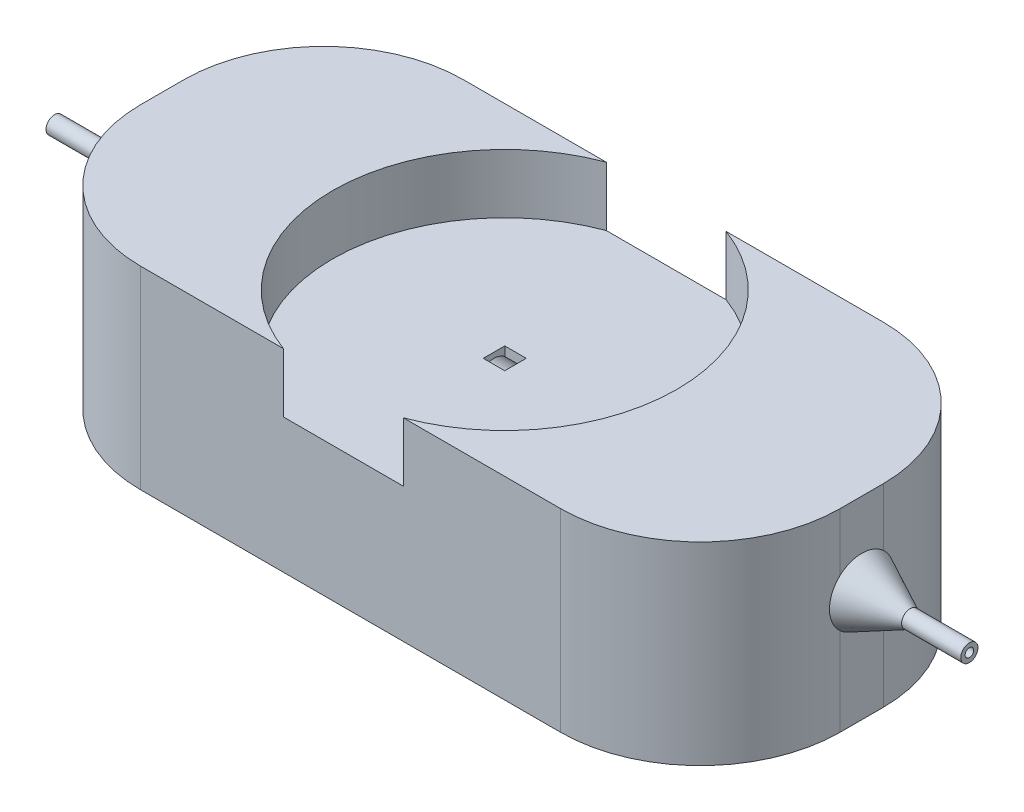
ISO-10303-21;
HEADER;
FILE_DESCRIPTION(('STEP AP214'),'2;1');
FILE_NAME('part.step','',(''),(''),'','','');
FILE_SCHEMA(('AUTOMOTIVE_DESIGN { 1 0 10303 214 1 1 1 1 }'));
ENDSEC;
DATA;
#1=APPLICATION_CONTEXT('core data for automotive mechanical design processes');
#2=APPLICATION_PROTOCOL_DEFINITION('international standard','automotive_design',2000,#1);
#3=PRODUCT_CONTEXT('',#1,'mechanical');
#4=PRODUCT('Part','Part','',(#3));
#5=PRODUCT_RELATED_PRODUCT_CATEGORY('part','',(#4));
#6=PRODUCT_DEFINITION_FORMATION('','',#4);
#7=PRODUCT_DEFINITION_CONTEXT('part definition',#1,'design');
#8=PRODUCT_DEFINITION('design','',#6,#7);
#9=PRODUCT_DEFINITION_SHAPE('','',#8);
#10=(LENGTH_UNIT() NAMED_UNIT(*) SI_UNIT(.MILLI.,.METRE.));
#11=(NAMED_UNIT(*) PLANE_ANGLE_UNIT() SI_UNIT($,.RADIAN.));
#12=(NAMED_UNIT(*) SI_UNIT($,.STERADIAN.) SOLID_ANGLE_UNIT());
#13=UNCERTAINTY_MEASURE_WITH_UNIT(LENGTH_MEASURE(1.E-05),#10,'distance_accuracy_value','');
#14=(GEOMETRIC_REPRESENTATION_CONTEXT(3) GLOBAL_UNCERTAINTY_ASSIGNED_CONTEXT((#13)) GLOBAL_UNIT_ASSIGNED_CONTEXT((#10,
#11,#12)) REPRESENTATION_CONTEXT('',''));
#15=CARTESIAN_POINT('',(0.,0.,0.));
#16=DIRECTION('',(0.,0.,1.));
#17=DIRECTION('',(1.,0.,0.));
#18=AXIS2_PLACEMENT_3D('',#15,#16,#17);
#19=CARTESIAN_POINT('',(40.,58.,15.));
#20=DIRECTION('',(-1.,0.,0.));
#21=DIRECTION('',(0.,0.,1.));
#22=AXIS2_PLACEMENT_3D('',#19,#20,#21);
#23=PLANE('',#22);
#24=DIRECTION('',(0.,-1.,0.));
#25=VECTOR('',#24,1.);
#26=CARTESIAN_POINT('',(40.,58.,2.00000000000001));
#27=LINE('',#26,#25);
#28=CARTESIAN_POINT('',(40.,58.,2.00000000000001));
#29=VERTEX_POINT('',#28);
#30=CARTESIAN_POINT('',(40.,52.6346340871573,2.00000000000001));
#31=VERTEX_POINT('',#30);
#32=EDGE_CURVE('E220',#29,#31,#27,.T.);
#33=ORIENTED_EDGE('',*,*,#32,.T.);
#34=CARTESIAN_POINT('',(40.,50.3985661096575,0.));
#35=DIRECTION('',(1.,0.,0.));
#36=DIRECTION('',(0.,0.,-1.));
#37=AXIS2_PLACEMENT_3D('',#34,#35,#36);
#38=CIRCLE('',#37,3.);
#39=CARTESIAN_POINT('',(40.,52.6346340871573,-2.));
#40=VERTEX_POINT('',#39);
#41=EDGE_CURVE('E62',#40,#31,#38,.T.);
#42=ORIENTED_EDGE('',*,*,#41,.F.);
#43=DIRECTION('',(0.,-1.,0.));
#44=VECTOR('',#43,1.);
#45=CARTESIAN_POINT('',(40.,58.,-2.));
#46=LINE('',#45,#44);
#47=CARTESIAN_POINT('',(40.,58.,-2.));
#48=VERTEX_POINT('',#47);
#49=EDGE_CURVE('E369',#40,#48,#46,.F.);
#50=ORIENTED_EDGE('',*,*,#49,.T.);
#51=DIRECTION('',(0.,0.,-1.));
#52=VECTOR('',#51,1.);
#53=CARTESIAN_POINT('',(40.,58.,15.));
#54=LINE('',#53,#52);
#55=EDGE_CURVE('E350',#29,#48,#54,.T.);
#56=ORIENTED_EDGE('',*,*,#55,.F.);
#57=EDGE_LOOP('',(#33,#42,#50,#56));
#58=FACE_BOUND('',#57,.T.);
#59=ADVANCED_FACE('F45',(#58),#23,.F.);
#60=CARTESIAN_POINT('',(-25.,58.,15.));
#61=DIRECTION('',(1.,0.,0.));
#62=DIRECTION('',(0.,0.,-1.));
#63=AXIS2_PLACEMENT_3D('',#60,#61,#62);
#64=PLANE('',#63);
#65=DIRECTION('',(0.,-1.,0.));
#66=VECTOR('',#65,1.);
#67=CARTESIAN_POINT('',(-25.,58.,-1.99999999999999));
#68=LINE('',#67,#66);
#69=CARTESIAN_POINT('',(-25.,58.,-1.99999999999999));
#70=VERTEX_POINT('',#69);
#71=CARTESIAN_POINT('',(-25.,52.6360679774998,-1.99999999999999));
#72=VERTEX_POINT('',#71);
#73=EDGE_CURVE('E384',#70,#72,#68,.T.);
#74=ORIENTED_EDGE('',*,*,#73,.T.);
#75=CARTESIAN_POINT('',(-25.,50.4,0.));
#76=DIRECTION('',(1.,0.,0.));
#77=DIRECTION('',(0.,0.,-1.));
#78=AXIS2_PLACEMENT_3D('',#75,#76,#77);
#79=CIRCLE('',#78,3.);
#80=CARTESIAN_POINT('',(-25.,52.6360679774998,2.00000000000001));
#81=VERTEX_POINT('',#80);
#82=EDGE_CURVE('E264',#72,#81,#79,.T.);
#83=ORIENTED_EDGE('',*,*,#82,.T.);
#84=DIRECTION('',(0.,-1.,0.));
#85=VECTOR('',#84,1.);
#86=CARTESIAN_POINT('',(-25.,58.,2.00000000000001));
#87=LINE('',#86,#85);
#88=CARTESIAN_POINT('',(-25.,58.,2.00000000000001));
#89=VERTEX_POINT('',#88);
#90=EDGE_CURVE('E379',#81,#89,#87,.F.);
#91=ORIENTED_EDGE('',*,*,#90,.T.);
#92=DIRECTION('',(0.,0.,1.));
#93=VECTOR('',#92,1.);
#94=CARTESIAN_POINT('',(-25.,58.,15.));
#95=LINE('',#94,#93);
#96=EDGE_CURVE('E357',#70,#89,#95,.T.);
#97=ORIENTED_EDGE('',*,*,#96,.F.);
#98=EDGE_LOOP('',(#74,#83,#91,#97));
#99=FACE_BOUND('',#98,.T.);
#100=ADVANCED_FACE('F448',(#99),#64,.F.);
#101=CARTESIAN_POINT('',(0.,58.,0.));
#102=DIRECTION('',(0.,-1.,0.));
#103=DIRECTION('',(0.,0.,-1.));
#104=AXIS2_PLACEMENT_3D('',#101,#102,#103);
#105=PLANE('',#104);
#106=DIRECTION('',(-1.,0.,0.));
#107=VECTOR('',#106,1.);
#108=CARTESIAN_POINT('',(-25.,58.,-15.));
#109=LINE('',#108,#107);
#110=CARTESIAN_POINT('',(27.,58.,-15.));
#111=VERTEX_POINT('',#110);
#112=CARTESIAN_POINT('',(12.3962726493241,58.,-15.));
#113=VERTEX_POINT('',#112);
#114=EDGE_CURVE('E354',#111,#113,#109,.T.);
#115=ORIENTED_EDGE('',*,*,#114,.T.);
#116=CARTESIAN_POINT('',(6.82850828649366,58.,-1.6826817716975E-13));
#117=DIRECTION('',(0.,1.,0.));
#118=DIRECTION('',(0.,0.,1.));
#119=AXIS2_PLACEMENT_3D('',#116,#117,#118);
#120=CIRCLE('',#119,16.);
#121=CARTESIAN_POINT('',(12.3962726493232,58.,15.));
#122=VERTEX_POINT('',#121);
#123=EDGE_CURVE('E303',#122,#113,#120,.T.);
#124=ORIENTED_EDGE('',*,*,#123,.F.);
#125=DIRECTION('',(1.,0.,0.));
#126=VECTOR('',#125,1.);
#127=CARTESIAN_POINT('',(-25.,58.,15.));
#128=LINE('',#127,#126);
#129=CARTESIAN_POINT('',(27.,58.,15.));
#130=VERTEX_POINT('',#129);
#131=EDGE_CURVE('E360',#122,#130,#128,.T.);
#132=ORIENTED_EDGE('',*,*,#131,.T.);
#133=CARTESIAN_POINT('',(27.,58.,2.00000000000001));
#134=DIRECTION('',(0.,-1.,0.));
#135=DIRECTION('',(0.,0.,-1.));
#136=AXIS2_PLACEMENT_3D('',#133,#134,#135);
#137=CIRCLE('',#136,13.);
#138=EDGE_CURVE('E373',#130,#29,#137,.F.);
#139=ORIENTED_EDGE('',*,*,#138,.T.);
#140=ORIENTED_EDGE('',*,*,#55,.T.);
#141=CARTESIAN_POINT('',(27.,58.,-2.));
#142=DIRECTION('',(0.,-1.,0.));
#143=DIRECTION('',(0.,0.,-1.));
#144=AXIS2_PLACEMENT_3D('',#141,#142,#143);
#145=CIRCLE('',#144,13.);
#146=EDGE_CURVE('E377',#48,#111,#145,.F.);
#147=ORIENTED_EDGE('',*,*,#146,.T.);
#148=EDGE_LOOP('',(#115,#124,#132,#139,#140,#147));
#149=FACE_BOUND('',#148,.T.);
#150=ADVANCED_FACE('F455',(#149),#105,.F.);
#151=CARTESIAN_POINT('',(40.,40.,-2.));
#152=VERTEX_POINT('',#151);
#153=CARTESIAN_POINT('',(40.,48.1624981321577,-2.));
#154=VERTEX_POINT('',#153);
#155=EDGE_CURVE('E226',#152,#154,#46,.F.);
#156=ORIENTED_EDGE('',*,*,#155,.T.);
#157=CARTESIAN_POINT('',(40.,48.1624981321577,2.00000000000001));
#158=VERTEX_POINT('',#157);
#159=EDGE_CURVE('E224',#158,#154,#38,.T.);
#160=ORIENTED_EDGE('',*,*,#159,.F.);
#161=CARTESIAN_POINT('',(40.,40.,2.00000000000001));
#162=VERTEX_POINT('',#161);
#163=EDGE_CURVE('E209',#158,#162,#27,.T.);
#164=ORIENTED_EDGE('',*,*,#163,.T.);
#165=DIRECTION('',(0.,0.,1.));
#166=VECTOR('',#165,1.);
#167=CARTESIAN_POINT('',(40.,40.,15.));
#168=LINE('',#167,#166);
#169=EDGE_CURVE('E345',#152,#162,#168,.T.);
#170=ORIENTED_EDGE('',*,*,#169,.F.);
#171=EDGE_LOOP('',(#156,#160,#164,#170));
#172=FACE_BOUND('',#171,.T.);
#173=ADVANCED_FACE('F225',(#172),#23,.F.);
#174=CARTESIAN_POINT('',(-25.,58.,-15.));
#175=DIRECTION('',(0.,0.,1.));
#176=DIRECTION('',(1.,0.,0.));
#177=AXIS2_PLACEMENT_3D('',#174,#175,#176);
#178=PLANE('',#177);
#179=DIRECTION('',(-1.,0.,0.));
#180=VECTOR('',#179,1.);
#181=CARTESIAN_POINT('',(-25.,52.5,-15.));
#182=LINE('',#181,#180);
#183=CARTESIAN_POINT('',(12.3962726493241,52.5,-15.));
#184=VERTEX_POINT('',#183);
#185=CARTESIAN_POINT('',(1.26074392366317,52.5,-15.));
#186=VERTEX_POINT('',#185);
#187=EDGE_CURVE('E332',#184,#186,#182,.T.);
#188=ORIENTED_EDGE('',*,*,#187,.F.);
#189=DIRECTION('',(0.,1.,0.));
#190=VECTOR('',#189,1.);
#191=CARTESIAN_POINT('',(12.3962726493241,52.5,-15.));
#192=LINE('',#191,#190);
#193=EDGE_CURVE('E329',#184,#113,#192,.T.);
#194=ORIENTED_EDGE('',*,*,#193,.T.);
#195=ORIENTED_EDGE('',*,*,#114,.F.);
#196=DIRECTION('',(0.,-1.,0.));
#197=VECTOR('',#196,1.);
#198=CARTESIAN_POINT('',(27.,58.,-15.));
#199=LINE('',#198,#197);
#200=CARTESIAN_POINT('',(27.,40.,-15.));
#201=VERTEX_POINT('',#200);
#202=EDGE_CURVE('E221',#111,#201,#199,.T.);
#203=ORIENTED_EDGE('',*,*,#202,.T.);
#204=DIRECTION('',(1.,0.,0.));
#205=VECTOR('',#204,1.);
#206=CARTESIAN_POINT('',(-25.,40.,-15.));
#207=LINE('',#206,#205);
#208=CARTESIAN_POINT('',(-12.,40.,-15.));
#209=VERTEX_POINT('',#208);
#210=EDGE_CURVE('E343',#209,#201,#207,.T.);
#211=ORIENTED_EDGE('',*,*,#210,.F.);
#212=DIRECTION('',(0.,-1.,0.));
#213=VECTOR('',#212,1.);
#214=CARTESIAN_POINT('',(-12.,58.,-15.));
#215=LINE('',#214,#213);
#216=CARTESIAN_POINT('',(-12.,58.,-15.));
#217=VERTEX_POINT('',#216);
#218=EDGE_CURVE('E364',#209,#217,#215,.F.);
#219=ORIENTED_EDGE('',*,*,#218,.T.);
#220=CARTESIAN_POINT('',(1.26074392366317,58.,-15.));
#221=VERTEX_POINT('',#220);
#222=EDGE_CURVE('E353',#221,#217,#109,.T.);
#223=ORIENTED_EDGE('',*,*,#222,.F.);
#224=DIRECTION('',(0.,1.,0.));
#225=VECTOR('',#224,1.);
#226=CARTESIAN_POINT('',(1.26074392366316,52.5,-15.));
#227=LINE('',#226,#225);
#228=EDGE_CURVE('E326',#221,#186,#227,.F.);
#229=ORIENTED_EDGE('',*,*,#228,.T.);
#230=EDGE_LOOP('',(#188,#194,#195,#203,#211,#219,#223,#229));
#231=FACE_BOUND('',#230,.T.);
#232=ADVANCED_FACE('F461',(#231),#178,.F.);
#233=CARTESIAN_POINT('',(-25.,40.,2.00000000000001));
#234=VERTEX_POINT('',#233);
#235=CARTESIAN_POINT('',(-25.,48.1639320225002,2.00000000000001));
#236=VERTEX_POINT('',#235);
#237=EDGE_CURVE('E380',#234,#236,#87,.F.);
#238=ORIENTED_EDGE('',*,*,#237,.T.);
#239=CARTESIAN_POINT('',(-25.,48.1639320225002,-1.99999999999999));
#240=VERTEX_POINT('',#239);
#241=EDGE_CURVE('E500',#236,#240,#79,.T.);
#242=ORIENTED_EDGE('',*,*,#241,.T.);
#243=CARTESIAN_POINT('',(-25.,40.,-1.99999999999999));
#244=VERTEX_POINT('',#243);
#245=EDGE_CURVE('E383',#240,#244,#68,.T.);
#246=ORIENTED_EDGE('',*,*,#245,.T.);
#247=DIRECTION('',(0.,0.,-1.));
#248=VECTOR('',#247,1.);
#249=CARTESIAN_POINT('',(-25.,40.,15.));
#250=LINE('',#249,#248);
#251=EDGE_CURVE('E336',#234,#244,#250,.T.);
#252=ORIENTED_EDGE('',*,*,#251,.F.);
#253=EDGE_LOOP('',(#238,#242,#246,#252));
#254=FACE_BOUND('',#253,.T.);
#255=ADVANCED_FACE('F458',(#254),#64,.F.);
#256=CARTESIAN_POINT('',(-25.,58.,15.));
#257=DIRECTION('',(0.,0.,-1.));
#258=DIRECTION('',(-1.,0.,0.));
#259=AXIS2_PLACEMENT_3D('',#256,#257,#258);
#260=PLANE('',#259);
#261=DIRECTION('',(1.,0.,0.));
#262=VECTOR('',#261,1.);
#263=CARTESIAN_POINT('',(-25.,52.5,15.));
#264=LINE('',#263,#262);
#265=CARTESIAN_POINT('',(1.2607439236641,52.5,15.));
#266=VERTEX_POINT('',#265);
#267=CARTESIAN_POINT('',(12.3962726493232,52.5,15.));
#268=VERTEX_POINT('',#267);
#269=EDGE_CURVE('E399',#266,#268,#264,.T.);
#270=ORIENTED_EDGE('',*,*,#269,.F.);
#271=DIRECTION('',(0.,1.,0.));
#272=VECTOR('',#271,1.);
#273=CARTESIAN_POINT('',(1.26074392366409,52.5,15.));
#274=LINE('',#273,#272);
#275=CARTESIAN_POINT('',(1.2607439236641,58.,15.));
#276=VERTEX_POINT('',#275);
#277=EDGE_CURVE('E323',#266,#276,#274,.T.);
#278=ORIENTED_EDGE('',*,*,#277,.T.);
#279=CARTESIAN_POINT('',(-12.,58.,15.));
#280=VERTEX_POINT('',#279);
#281=EDGE_CURVE('E361',#280,#276,#128,.T.);
#282=ORIENTED_EDGE('',*,*,#281,.F.);
#283=DIRECTION('',(0.,-1.,0.));
#284=VECTOR('',#283,1.);
#285=CARTESIAN_POINT('',(-12.,58.,15.));
#286=LINE('',#285,#284);
#287=CARTESIAN_POINT('',(-12.,40.,15.));
#288=VERTEX_POINT('',#287);
#289=EDGE_CURVE('E387',#280,#288,#286,.T.);
#290=ORIENTED_EDGE('',*,*,#289,.T.);
#291=DIRECTION('',(-1.,0.,0.));
#292=VECTOR('',#291,1.);
#293=CARTESIAN_POINT('',(-25.,40.,15.));
#294=LINE('',#293,#292);
#295=CARTESIAN_POINT('',(27.,40.,15.));
#296=VERTEX_POINT('',#295);
#297=EDGE_CURVE('E334',#296,#288,#294,.T.);
#298=ORIENTED_EDGE('',*,*,#297,.F.);
#299=DIRECTION('',(0.,-1.,0.));
#300=VECTOR('',#299,1.);
#301=CARTESIAN_POINT('',(27.,58.,15.));
#302=LINE('',#301,#300);
#303=EDGE_CURVE('E390',#296,#130,#302,.F.);
#304=ORIENTED_EDGE('',*,*,#303,.T.);
#305=ORIENTED_EDGE('',*,*,#131,.F.);
#306=DIRECTION('',(0.,1.,0.));
#307=VECTOR('',#306,1.);
#308=CARTESIAN_POINT('',(12.3962726493232,52.5,15.));
#309=LINE('',#308,#307);
#310=EDGE_CURVE('E318',#122,#268,#309,.F.);
#311=ORIENTED_EDGE('',*,*,#310,.T.);
#312=EDGE_LOOP('',(#270,#278,#282,#290,#298,#304,#305,#311));
#313=FACE_BOUND('',#312,.T.);
#314=ADVANCED_FACE('F493',(#313),#260,.F.);
#315=CARTESIAN_POINT('',(27.,58.,-2.));
#316=DIRECTION('',(0.,-1.,0.));
#317=DIRECTION('',(0.,0.,-1.));
#318=AXIS2_PLACEMENT_3D('',#315,#316,#317);
#319=CYLINDRICAL_SURFACE('',#318,13.);
#320=ORIENTED_EDGE('',*,*,#155,.F.);
#321=CARTESIAN_POINT('',(27.,40.,-2.));
#322=DIRECTION('',(0.,-1.,0.));
#323=DIRECTION('',(0.,0.,-1.));
#324=AXIS2_PLACEMENT_3D('',#321,#322,#323);
#325=CIRCLE('',#324,13.);
#326=EDGE_CURVE('E347',#152,#201,#325,.F.);
#327=ORIENTED_EDGE('',*,*,#326,.T.);
#328=ORIENTED_EDGE('',*,*,#202,.F.);
#329=ORIENTED_EDGE('',*,*,#146,.F.);
#330=ORIENTED_EDGE('',*,*,#49,.F.);
#331=DIRECTION('',(0.,-1.,0.));
#332=VECTOR('',#331,1.);
#333=CARTESIAN_POINT('',(40.,58.,-2.));
#334=LINE('',#333,#332);
#335=EDGE_CURVE('E69',#154,#40,#334,.F.);
#336=ORIENTED_EDGE('',*,*,#335,.F.);
#337=EDGE_LOOP('',(#320,#327,#328,#329,#330,#336));
#338=FACE_BOUND('',#337,.T.);
#339=ADVANCED_FACE('F522',(#338),#319,.T.);
#340=CARTESIAN_POINT('',(-12.,58.,-1.99999999999999));
#341=DIRECTION('',(0.,-1.,0.));
#342=DIRECTION('',(0.,0.,-1.));
#343=AXIS2_PLACEMENT_3D('',#340,#341,#342);
#344=CYLINDRICAL_SURFACE('',#343,13.);
#345=ORIENTED_EDGE('',*,*,#218,.F.);
#346=CARTESIAN_POINT('',(-12.,40.,-1.99999999999999));
#347=DIRECTION('',(0.,-1.,0.));
#348=DIRECTION('',(0.,0.,-1.));
#349=AXIS2_PLACEMENT_3D('',#346,#347,#348);
#350=CIRCLE('',#349,13.);
#351=EDGE_CURVE('E340',#209,#244,#350,.F.);
#352=ORIENTED_EDGE('',*,*,#351,.T.);
#353=ORIENTED_EDGE('',*,*,#245,.F.);
#354=DIRECTION('',(0.,-1.,0.));
#355=VECTOR('',#354,1.);
#356=CARTESIAN_POINT('',(-25.,58.,-1.99999999999999));
#357=LINE('',#356,#355);
#358=EDGE_CURVE('E274',#240,#72,#357,.F.);
#359=ORIENTED_EDGE('',*,*,#358,.T.);
#360=ORIENTED_EDGE('',*,*,#73,.F.);
#361=CARTESIAN_POINT('',(-12.,58.,-1.99999999999999));
#362=DIRECTION('',(0.,-1.,0.));
#363=DIRECTION('',(0.,0.,-1.));
#364=AXIS2_PLACEMENT_3D('',#361,#362,#363);
#365=CIRCLE('',#364,13.);
#366=EDGE_CURVE('E375',#217,#70,#365,.F.);
#367=ORIENTED_EDGE('',*,*,#366,.F.);
#368=EDGE_LOOP('',(#345,#352,#353,#359,#360,#367));
#369=FACE_BOUND('',#368,.T.);
#370=ADVANCED_FACE('F504',(#369),#344,.T.);
#371=CARTESIAN_POINT('',(27.,58.,2.00000000000001));
#372=DIRECTION('',(0.,-1.,0.));
#373=DIRECTION('',(0.,0.,-1.));
#374=AXIS2_PLACEMENT_3D('',#371,#372,#373);
#375=CYLINDRICAL_SURFACE('',#374,13.);
#376=ORIENTED_EDGE('',*,*,#303,.F.);
#377=CARTESIAN_POINT('',(27.,40.,2.00000000000001));
#378=DIRECTION('',(0.,-1.,0.));
#379=DIRECTION('',(0.,0.,-1.));
#380=AXIS2_PLACEMENT_3D('',#377,#378,#379);
#381=CIRCLE('',#380,13.);
#382=EDGE_CURVE('E216',#296,#162,#381,.F.);
#383=ORIENTED_EDGE('',*,*,#382,.T.);
#384=ORIENTED_EDGE('',*,*,#163,.F.);
#385=DIRECTION('',(0.,-1.,0.));
#386=VECTOR('',#385,1.);
#387=CARTESIAN_POINT('',(40.,58.,2.00000000000001));
#388=LINE('',#387,#386);
#389=EDGE_CURVE('E215',#158,#31,#388,.F.);
#390=ORIENTED_EDGE('',*,*,#389,.T.);
#391=ORIENTED_EDGE('',*,*,#32,.F.);
#392=ORIENTED_EDGE('',*,*,#138,.F.);
#393=EDGE_LOOP('',(#376,#383,#384,#390,#391,#392));
#394=FACE_BOUND('',#393,.T.);
#395=ADVANCED_FACE('F212',(#394),#375,.T.);
#396=CARTESIAN_POINT('',(-12.,58.,2.00000000000001));
#397=DIRECTION('',(0.,-1.,0.));
#398=DIRECTION('',(0.,0.,-1.));
#399=AXIS2_PLACEMENT_3D('',#396,#397,#398);
#400=CYLINDRICAL_SURFACE('',#399,13.);
#401=ORIENTED_EDGE('',*,*,#237,.F.);
#402=CARTESIAN_POINT('',(-12.,40.,2.00000000000001));
#403=DIRECTION('',(0.,-1.,0.));
#404=DIRECTION('',(0.,0.,-1.));
#405=AXIS2_PLACEMENT_3D('',#402,#403,#404);
#406=CIRCLE('',#405,13.);
#407=EDGE_CURVE('E393',#234,#288,#406,.F.);
#408=ORIENTED_EDGE('',*,*,#407,.T.);
#409=ORIENTED_EDGE('',*,*,#289,.F.);
#410=CARTESIAN_POINT('',(-12.,58.,2.00000000000001));
#411=DIRECTION('',(0.,-1.,0.));
#412=DIRECTION('',(0.,0.,-1.));
#413=AXIS2_PLACEMENT_3D('',#410,#411,#412);
#414=CIRCLE('',#413,13.);
#415=EDGE_CURVE('E371',#89,#280,#414,.F.);
#416=ORIENTED_EDGE('',*,*,#415,.F.);
#417=ORIENTED_EDGE('',*,*,#90,.F.);
#418=DIRECTION('',(0.,-1.,0.));
#419=VECTOR('',#418,1.);
#420=CARTESIAN_POINT('',(-25.,58.,2.00000000000001));
#421=LINE('',#420,#419);
#422=EDGE_CURVE('E271',#236,#81,#421,.F.);
#423=ORIENTED_EDGE('',*,*,#422,.F.);
#424=EDGE_LOOP('',(#401,#408,#409,#416,#417,#423));
#425=FACE_BOUND('',#424,.T.);
#426=ADVANCED_FACE('F47',(#425),#400,.T.);
#427=ORIENTED_EDGE('',*,*,#281,.T.);
#428=CARTESIAN_POINT('',(6.82850828649366,58.,-1.6826817716975E-13));
#429=DIRECTION('',(0.,-1.,0.));
#430=DIRECTION('',(0.,0.,-1.));
#431=AXIS2_PLACEMENT_3D('',#428,#429,#430);
#432=CIRCLE('',#431,16.);
#433=EDGE_CURVE('E396',#276,#221,#432,.T.);
#434=ORIENTED_EDGE('',*,*,#433,.T.);
#435=ORIENTED_EDGE('',*,*,#222,.T.);
#436=ORIENTED_EDGE('',*,*,#366,.T.);
#437=ORIENTED_EDGE('',*,*,#96,.T.);
#438=ORIENTED_EDGE('',*,*,#415,.T.);
#439=EDGE_LOOP('',(#427,#434,#435,#436,#437,#438));
#440=FACE_BOUND('',#439,.T.);
#441=ADVANCED_FACE('F470',(#440),#105,.F.);
#442=CARTESIAN_POINT('',(0.,40.,0.));
#443=DIRECTION('',(0.,-1.,0.));
#444=DIRECTION('',(0.,0.,-1.));
#445=AXIS2_PLACEMENT_3D('',#442,#443,#444);
#446=PLANE('',#445);
#447=ORIENTED_EDGE('',*,*,#169,.T.);
#448=ORIENTED_EDGE('',*,*,#382,.F.);
#449=ORIENTED_EDGE('',*,*,#297,.T.);
#450=ORIENTED_EDGE('',*,*,#407,.F.);
#451=ORIENTED_EDGE('',*,*,#251,.T.);
#452=ORIENTED_EDGE('',*,*,#351,.F.);
#453=ORIENTED_EDGE('',*,*,#210,.T.);
#454=ORIENTED_EDGE('',*,*,#326,.F.);
#455=EDGE_LOOP('',(#447,#448,#449,#450,#451,#452,#453,#454));
#456=FACE_BOUND('',#455,.T.);
#457=ADVANCED_FACE('F477',(#456),#446,.T.);
#458=CARTESIAN_POINT('',(6.82850828649366,52.5,-1.6826817716975E-13));
#459=DIRECTION('',(0.,1.,0.));
#460=DIRECTION('',(0.,0.,1.));
#461=AXIS2_PLACEMENT_3D('',#458,#459,#460);
#462=PLANE('',#461);
#463=DIRECTION('',(0.,0.,-1.));
#464=VECTOR('',#463,1.);
#465=CARTESIAN_POINT('',(7.82850828649366,52.5,0.999999999999832));
#466=LINE('',#465,#464);
#467=CARTESIAN_POINT('',(7.82850828649366,52.5,0.999999999999832));
#468=VERTEX_POINT('',#467);
#469=CARTESIAN_POINT('',(7.82850828649366,52.5,-1.00000000000017));
#470=VERTEX_POINT('',#469);
#471=EDGE_CURVE('E276',#468,#470,#466,.T.);
#472=ORIENTED_EDGE('',*,*,#471,.F.);
#473=DIRECTION('',(1.,0.,0.));
#474=VECTOR('',#473,1.);
#475=CARTESIAN_POINT('',(5.82850828649366,52.5,0.999999999999832));
#476=LINE('',#475,#474);
#477=CARTESIAN_POINT('',(5.82850828649366,52.5,0.999999999999832));
#478=VERTEX_POINT('',#477);
#479=EDGE_CURVE('E281',#478,#468,#476,.T.);
#480=ORIENTED_EDGE('',*,*,#479,.F.);
#481=DIRECTION('',(0.,0.,1.));
#482=VECTOR('',#481,1.);
#483=CARTESIAN_POINT('',(5.82850828649366,52.5,0.999999999999832));
#484=LINE('',#483,#482);
#485=CARTESIAN_POINT('',(5.82850828649366,52.5,-1.00000000000017));
#486=VERTEX_POINT('',#485);
#487=EDGE_CURVE('E295',#486,#478,#484,.T.);
#488=ORIENTED_EDGE('',*,*,#487,.F.);
#489=DIRECTION('',(-1.,0.,0.));
#490=VECTOR('',#489,1.);
#491=CARTESIAN_POINT('',(5.82850828649366,52.5,-1.00000000000017));
#492=LINE('',#491,#490);
#493=EDGE_CURVE('E292',#470,#486,#492,.T.);
#494=ORIENTED_EDGE('',*,*,#493,.F.);
#495=EDGE_LOOP('',(#472,#480,#488,#494));
#496=FACE_BOUND('',#495,.T.);
#497=ORIENTED_EDGE('',*,*,#187,.T.);
#498=CARTESIAN_POINT('',(6.82850828649366,52.5,-1.6826817716975E-13));
#499=DIRECTION('',(0.,1.,0.));
#500=DIRECTION('',(0.,0.,1.));
#501=AXIS2_PLACEMENT_3D('',#498,#499,#500);
#502=CIRCLE('',#501,16.);
#503=EDGE_CURVE('E319',#186,#266,#502,.T.);
#504=ORIENTED_EDGE('',*,*,#503,.T.);
#505=ORIENTED_EDGE('',*,*,#269,.T.);
#506=EDGE_CURVE('E315',#268,#184,#502,.T.);
#507=ORIENTED_EDGE('',*,*,#506,.T.);
#508=EDGE_LOOP('',(#497,#504,#505,#507));
#509=FACE_BOUND('',#508,.T.);
#510=ADVANCED_FACE('F483',(#496,#509),#462,.T.);
#511=CARTESIAN_POINT('',(6.82850828649366,52.5,-1.6826817716975E-13));
#512=DIRECTION('',(0.,1.,0.));
#513=DIRECTION('',(0.,0.,1.));
#514=AXIS2_PLACEMENT_3D('',#511,#512,#513);
#515=CYLINDRICAL_SURFACE('',#514,16.);
#516=ORIENTED_EDGE('',*,*,#506,.F.);
#517=ORIENTED_EDGE('',*,*,#310,.F.);
#518=ORIENTED_EDGE('',*,*,#123,.T.);
#519=ORIENTED_EDGE('',*,*,#193,.F.);
#520=EDGE_LOOP('',(#516,#517,#518,#519));
#521=FACE_BOUND('',#520,.T.);
#522=ADVANCED_FACE('F528',(#521),#515,.F.);
#523=ORIENTED_EDGE('',*,*,#433,.F.);
#524=ORIENTED_EDGE('',*,*,#277,.F.);
#525=ORIENTED_EDGE('',*,*,#503,.F.);
#526=ORIENTED_EDGE('',*,*,#228,.F.);
#527=EDGE_LOOP('',(#523,#524,#525,#526));
#528=FACE_BOUND('',#527,.T.);
#529=ADVANCED_FACE('F535',(#528),#515,.F.);
#530=CARTESIAN_POINT('',(40.001,50.4,0.));
#531=DIRECTION('',(-1.,0.,0.));
#532=DIRECTION('',(0.,0.,1.));
#533=AXIS2_PLACEMENT_3D('',#530,#531,#532);
#534=CYLINDRICAL_SURFACE('',#533,1.6);
#535=DIRECTION('',(-1.,0.,0.));
#536=VECTOR('',#535,1.);
#537=CARTESIAN_POINT('',(40.001,49.1510004003205,-1.00000000000017));
#538=LINE('',#537,#536);
#539=CARTESIAN_POINT('',(5.82850828649366,49.1510004003205,-1.00000000000017));
#540=VERTEX_POINT('',#539);
#541=CARTESIAN_POINT('',(7.82850828649365,49.1510004003205,-1.00000000000017));
#542=VERTEX_POINT('',#541);
#543=EDGE_CURVE('E411',#540,#542,#538,.F.);
#544=ORIENTED_EDGE('',*,*,#543,.T.);
#545=CARTESIAN_POINT('',(7.82850828649365,50.4,0.));
#546=DIRECTION('',(1.,0.,0.));
#547=DIRECTION('',(0.,0.,-1.));
#548=AXIS2_PLACEMENT_3D('',#545,#546,#547);
#549=CIRCLE('',#548,1.6);
#550=CARTESIAN_POINT('',(7.82850828649366,49.1510004003202,0.999999999999832));
#551=VERTEX_POINT('',#550);
#552=EDGE_CURVE('E11',#542,#551,#549,.F.);
#553=ORIENTED_EDGE('',*,*,#552,.T.);
#554=DIRECTION('',(-1.,0.,0.));
#555=VECTOR('',#554,1.);
#556=CARTESIAN_POINT('',(40.001,49.1510004003202,0.999999999999832));
#557=LINE('',#556,#555);
#558=CARTESIAN_POINT('',(5.82850828649366,49.1510004003202,0.999999999999832));
#559=VERTEX_POINT('',#558);
#560=EDGE_CURVE('E49',#551,#559,#557,.T.);
#561=ORIENTED_EDGE('',*,*,#560,.T.);
#562=CARTESIAN_POINT('',(5.82850828649366,50.4,0.));
#563=DIRECTION('',(-1.,0.,0.));
#564=DIRECTION('',(0.,0.,1.));
#565=AXIS2_PLACEMENT_3D('',#562,#563,#564);
#566=CIRCLE('',#565,1.6);
#567=EDGE_CURVE('E408',#559,#540,#566,.F.);
#568=ORIENTED_EDGE('',*,*,#567,.T.);
#569=EDGE_LOOP('',(#544,#553,#561,#568));
#570=FACE_BOUND('',#569,.T.);
#571=DIRECTION('',(-1.,0.,0.));
#572=VECTOR('',#571,1.);
#573=CARTESIAN_POINT('',(40.001,51.6489995996798,0.999999999999832));
#574=LINE('',#573,#572);
#575=CARTESIAN_POINT('',(5.82850828649366,51.6489995996798,0.999999999999832));
#576=VERTEX_POINT('',#575);
#577=CARTESIAN_POINT('',(7.82850828649366,51.6489995996798,0.999999999999832));
#578=VERTEX_POINT('',#577);
#579=EDGE_CURVE('E407',#576,#578,#574,.F.);
#580=ORIENTED_EDGE('',*,*,#579,.T.);
#581=CARTESIAN_POINT('',(7.82850828649366,51.6489995996795,-1.00000000000017));
#582=VERTEX_POINT('',#581);
#583=EDGE_CURVE('E55',#578,#582,#549,.F.);
#584=ORIENTED_EDGE('',*,*,#583,.T.);
#585=DIRECTION('',(-1.,0.,0.));
#586=VECTOR('',#585,1.);
#587=CARTESIAN_POINT('',(40.001,51.6489995996795,-1.00000000000017));
#588=LINE('',#587,#586);
#589=CARTESIAN_POINT('',(5.82850828649366,51.6489995996795,-1.00000000000017));
#590=VERTEX_POINT('',#589);
#591=EDGE_CURVE('E401',#582,#590,#588,.T.);
#592=ORIENTED_EDGE('',*,*,#591,.T.);
#593=EDGE_CURVE('E404',#590,#576,#566,.F.);
#594=ORIENTED_EDGE('',*,*,#593,.T.);
#595=EDGE_LOOP('',(#580,#584,#592,#594));
#596=FACE_BOUND('',#595,.T.);
#597=CARTESIAN_POINT('',(-25.,50.4,0.));
#598=DIRECTION('',(1.,0.,0.));
#599=DIRECTION('',(0.,0.,-1.));
#600=AXIS2_PLACEMENT_3D('',#597,#598,#599);
#601=CIRCLE('',#600,1.6);
#602=CARTESIAN_POINT('',(-25.,50.4,-1.6));
#603=VERTEX_POINT('',#602);
#604=EDGE_CURVE('E267',#603,#603,#601,.F.);
#605=ORIENTED_EDGE('',*,*,#604,.T.);
#606=EDGE_LOOP('',(#605));
#607=FACE_BOUND('',#606,.T.);
#608=CARTESIAN_POINT('',(40.,50.4,0.));
#609=DIRECTION('',(-1.,0.,0.));
#610=DIRECTION('',(0.,0.,1.));
#611=AXIS2_PLACEMENT_3D('',#608,#609,#610);
#612=CIRCLE('',#611,1.6);
#613=CARTESIAN_POINT('',(40.,50.4,1.6));
#614=VERTEX_POINT('',#613);
#615=EDGE_CURVE('E237',#614,#614,#612,.F.);
#616=ORIENTED_EDGE('',*,*,#615,.T.);
#617=EDGE_LOOP('',(#616));
#618=FACE_BOUND('',#617,.T.);
#619=ADVANCED_FACE('F416',(#570,#596,#607,#618),#534,.F.);
#620=CARTESIAN_POINT('',(5.82850828649366,44.5,-1.00000000000017));
#621=DIRECTION('',(0.,0.,-1.));
#622=DIRECTION('',(-1.,0.,0.));
#623=AXIS2_PLACEMENT_3D('',#620,#621,#622);
#624=PLANE('',#623);
#625=DIRECTION('',(0.,1.,0.));
#626=VECTOR('',#625,1.);
#627=CARTESIAN_POINT('',(7.82850828649366,44.5,-1.00000000000017));
#628=LINE('',#627,#626);
#629=EDGE_CURVE('E290',#582,#470,#628,.T.);
#630=ORIENTED_EDGE('',*,*,#629,.T.);
#631=ORIENTED_EDGE('',*,*,#493,.T.);
#632=DIRECTION('',(0.,1.,0.));
#633=VECTOR('',#632,1.);
#634=CARTESIAN_POINT('',(5.82850828649366,44.5,-1.00000000000017));
#635=LINE('',#634,#633);
#636=EDGE_CURVE('E312',#590,#486,#635,.T.);
#637=ORIENTED_EDGE('',*,*,#636,.F.);
#638=ORIENTED_EDGE('',*,*,#591,.F.);
#639=EDGE_LOOP('',(#630,#631,#637,#638));
#640=FACE_BOUND('',#639,.T.);
#641=ADVANCED_FACE('F435',(#640),#624,.F.);
#642=CARTESIAN_POINT('',(5.82850828649366,44.5,0.999999999999832));
#643=DIRECTION('',(-1.,0.,0.));
#644=DIRECTION('',(0.,0.,1.));
#645=AXIS2_PLACEMENT_3D('',#642,#643,#644);
#646=PLANE('',#645);
#647=ORIENTED_EDGE('',*,*,#636,.T.);
#648=ORIENTED_EDGE('',*,*,#487,.T.);
#649=DIRECTION('',(0.,1.,0.));
#650=VECTOR('',#649,1.);
#651=CARTESIAN_POINT('',(5.82850828649366,44.5,0.999999999999832));
#652=LINE('',#651,#650);
#653=EDGE_CURVE('E308',#576,#478,#652,.T.);
#654=ORIENTED_EDGE('',*,*,#653,.F.);
#655=ORIENTED_EDGE('',*,*,#593,.F.);
#656=EDGE_LOOP('',(#647,#648,#654,#655));
#657=FACE_BOUND('',#656,.T.);
#658=ADVANCED_FACE('F443',(#657),#646,.F.);
#659=CARTESIAN_POINT('',(5.82850828649366,44.5,0.999999999999832));
#660=DIRECTION('',(0.,0.,1.));
#661=DIRECTION('',(1.,0.,0.));
#662=AXIS2_PLACEMENT_3D('',#659,#660,#661);
#663=PLANE('',#662);
#664=ORIENTED_EDGE('',*,*,#653,.T.);
#665=ORIENTED_EDGE('',*,*,#479,.T.);
#666=DIRECTION('',(0.,1.,0.));
#667=VECTOR('',#666,1.);
#668=CARTESIAN_POINT('',(7.82850828649366,44.5,0.999999999999832));
#669=LINE('',#668,#667);
#670=EDGE_CURVE('E304',#578,#468,#669,.T.);
#671=ORIENTED_EDGE('',*,*,#670,.F.);
#672=ORIENTED_EDGE('',*,*,#579,.F.);
#673=EDGE_LOOP('',(#664,#665,#671,#672));
#674=FACE_BOUND('',#673,.T.);
#675=ADVANCED_FACE('F552',(#674),#663,.F.);
#676=CARTESIAN_POINT('',(7.82850828649366,44.5,0.999999999999832));
#677=DIRECTION('',(1.,0.,0.));
#678=DIRECTION('',(0.,0.,-1.));
#679=AXIS2_PLACEMENT_3D('',#676,#677,#678);
#680=PLANE('',#679);
#681=ORIENTED_EDGE('',*,*,#670,.T.);
#682=ORIENTED_EDGE('',*,*,#471,.T.);
#683=ORIENTED_EDGE('',*,*,#629,.F.);
#684=ORIENTED_EDGE('',*,*,#583,.F.);
#685=EDGE_LOOP('',(#681,#682,#683,#684));
#686=FACE_BOUND('',#685,.T.);
#687=ADVANCED_FACE('F546',(#686),#680,.F.);
#688=CARTESIAN_POINT('',(7.82850828649366,44.5,-1.00000000000017));
#689=VERTEX_POINT('',#688);
#690=EDGE_CURVE('E313',#689,#542,#628,.T.);
#691=ORIENTED_EDGE('',*,*,#690,.F.);
#692=DIRECTION('',(0.,0.,-1.));
#693=VECTOR('',#692,1.);
#694=CARTESIAN_POINT('',(7.82850828649366,44.5,0.999999999999832));
#695=LINE('',#694,#693);
#696=CARTESIAN_POINT('',(7.82850828649366,44.5,0.999999999999832));
#697=VERTEX_POINT('',#696);
#698=EDGE_CURVE('E277',#697,#689,#695,.T.);
#699=ORIENTED_EDGE('',*,*,#698,.F.);
#700=EDGE_CURVE('E300',#697,#551,#669,.T.);
#701=ORIENTED_EDGE('',*,*,#700,.T.);
#702=ORIENTED_EDGE('',*,*,#552,.F.);
#703=EDGE_LOOP('',(#691,#699,#701,#702));
#704=FACE_BOUND('',#703,.T.);
#705=ADVANCED_FACE('F424',(#704),#680,.F.);
#706=ORIENTED_EDGE('',*,*,#700,.F.);
#707=DIRECTION('',(1.,0.,0.));
#708=VECTOR('',#707,1.);
#709=CARTESIAN_POINT('',(5.82850828649366,44.5,0.999999999999832));
#710=LINE('',#709,#708);
#711=CARTESIAN_POINT('',(5.82850828649366,44.5,0.999999999999832));
#712=VERTEX_POINT('',#711);
#713=EDGE_CURVE('E287',#712,#697,#710,.T.);
#714=ORIENTED_EDGE('',*,*,#713,.F.);
#715=EDGE_CURVE('E305',#712,#559,#652,.T.);
#716=ORIENTED_EDGE('',*,*,#715,.T.);
#717=ORIENTED_EDGE('',*,*,#560,.F.);
#718=EDGE_LOOP('',(#706,#714,#716,#717));
#719=FACE_BOUND('',#718,.T.);
#720=ADVANCED_FACE('F420',(#719),#663,.F.);
#721=ORIENTED_EDGE('',*,*,#715,.F.);
#722=DIRECTION('',(0.,0.,1.));
#723=VECTOR('',#722,1.);
#724=CARTESIAN_POINT('',(5.82850828649366,44.5,0.999999999999832));
#725=LINE('',#724,#723);
#726=CARTESIAN_POINT('',(5.82850828649366,44.5,-1.00000000000017));
#727=VERTEX_POINT('',#726);
#728=EDGE_CURVE('E284',#727,#712,#725,.T.);
#729=ORIENTED_EDGE('',*,*,#728,.F.);
#730=EDGE_CURVE('E309',#727,#540,#635,.T.);
#731=ORIENTED_EDGE('',*,*,#730,.T.);
#732=ORIENTED_EDGE('',*,*,#567,.F.);
#733=EDGE_LOOP('',(#721,#729,#731,#732));
#734=FACE_BOUND('',#733,.T.);
#735=ADVANCED_FACE('F430',(#734),#646,.F.);
#736=ORIENTED_EDGE('',*,*,#730,.F.);
#737=DIRECTION('',(-1.,0.,0.));
#738=VECTOR('',#737,1.);
#739=CARTESIAN_POINT('',(5.82850828649366,44.5,-1.00000000000017));
#740=LINE('',#739,#738);
#741=EDGE_CURVE('E280',#689,#727,#740,.T.);
#742=ORIENTED_EDGE('',*,*,#741,.F.);
#743=ORIENTED_EDGE('',*,*,#690,.T.);
#744=ORIENTED_EDGE('',*,*,#543,.F.);
#745=EDGE_LOOP('',(#736,#742,#743,#744));
#746=FACE_BOUND('',#745,.T.);
#747=ADVANCED_FACE('F432',(#746),#624,.F.);
#748=CARTESIAN_POINT('',(0.,44.5,0.));
#749=DIRECTION('',(0.,-1.,0.));
#750=DIRECTION('',(0.,0.,-1.));
#751=AXIS2_PLACEMENT_3D('',#748,#749,#750);
#752=PLANE('',#751);
#753=ORIENTED_EDGE('',*,*,#698,.T.);
#754=ORIENTED_EDGE('',*,*,#741,.T.);
#755=ORIENTED_EDGE('',*,*,#728,.T.);
#756=ORIENTED_EDGE('',*,*,#713,.T.);
#757=EDGE_LOOP('',(#753,#754,#755,#756));
#758=FACE_BOUND('',#757,.T.);
#759=ADVANCED_FACE('F427',(#758),#752,.F.);
#760=CARTESIAN_POINT('',(-25.,50.8,0.));
#761=DIRECTION('',(1.,0.,0.));
#762=DIRECTION('',(0.,0.,-1.));
#763=AXIS2_PLACEMENT_3D('',#760,#761,#762);
#764=PLANE('',#763);
#765=ORIENTED_EDGE('',*,*,#358,.F.);
#766=EDGE_CURVE('E263',#240,#72,#79,.T.);
#767=ORIENTED_EDGE('',*,*,#766,.T.);
#768=EDGE_LOOP('',(#765,#767));
#769=FACE_BOUND('',#768,.T.);
#770=ADVANCED_FACE('F440',(#769),#764,.T.);
#771=CARTESIAN_POINT('',(-25.,50.4,0.));
#772=DIRECTION('',(1.,0.,0.));
#773=DIRECTION('',(0.,0.,-1.));
#774=AXIS2_PLACEMENT_3D('',#771,#772,#773);
#775=CIRCLE('',#774,0.399999999999998);
#776=CARTESIAN_POINT('',(-25.,50.4,-0.399999999999998));
#777=VERTEX_POINT('',#776);
#778=EDGE_CURVE('E251',#777,#777,#775,.T.);
#779=ORIENTED_EDGE('',*,*,#778,.F.);
#780=EDGE_LOOP('',(#779));
#781=FACE_BOUND('',#780,.T.);
#782=ORIENTED_EDGE('',*,*,#604,.F.);
#783=EDGE_LOOP('',(#782));
#784=FACE_BOUND('',#783,.T.);
#785=ADVANCED_FACE('F575',(#781,#784),#764,.T.);
#786=EDGE_CURVE('E268',#81,#236,#79,.T.);
#787=ORIENTED_EDGE('',*,*,#786,.T.);
#788=ORIENTED_EDGE('',*,*,#422,.T.);
#789=EDGE_LOOP('',(#787,#788));
#790=FACE_BOUND('',#789,.T.);
#791=ADVANCED_FACE('F515',(#790),#764,.T.);
#792=CARTESIAN_POINT('',(-25.,50.4,0.));
#793=DIRECTION('',(1.,0.,0.));
#794=DIRECTION('',(0.,0.,-1.));
#795=AXIS2_PLACEMENT_3D('',#792,#793,#794);
#796=CONICAL_SURFACE('',#795,3.,0.454719274820969);
#797=CARTESIAN_POINT('',(-29.5,50.4,0.));
#798=DIRECTION('',(1.,0.,0.));
#799=DIRECTION('',(0.,0.,-1.));
#800=AXIS2_PLACEMENT_3D('',#797,#798,#799);
#801=CIRCLE('',#800,0.800000000000002);
#802=CARTESIAN_POINT('',(-29.5,50.4,-0.800000000000002));
#803=VERTEX_POINT('',#802);
#804=EDGE_CURVE('E260',#803,#803,#801,.T.);
#805=ORIENTED_EDGE('',*,*,#804,.T.);
#806=EDGE_LOOP('',(#805));
#807=FACE_BOUND('',#806,.T.);
#808=ORIENTED_EDGE('',*,*,#82,.F.);
#809=ORIENTED_EDGE('',*,*,#766,.F.);
#810=ORIENTED_EDGE('',*,*,#241,.F.);
#811=ORIENTED_EDGE('',*,*,#786,.F.);
#812=EDGE_LOOP('',(#808,#809,#810,#811));
#813=FACE_BOUND('',#812,.T.);
#814=ADVANCED_FACE('F511',(#807,#813),#796,.T.);
#815=CARTESIAN_POINT('',(-25.,50.4,0.));
#816=DIRECTION('',(1.,0.,0.));
#817=DIRECTION('',(0.,0.,-1.));
#818=AXIS2_PLACEMENT_3D('',#815,#816,#817);
#819=CYLINDRICAL_SURFACE('',#818,0.800000000000002);
#820=CARTESIAN_POINT('',(-35.,50.4,0.));
#821=DIRECTION('',(1.,0.,0.));
#822=DIRECTION('',(0.,0.,-1.));
#823=AXIS2_PLACEMENT_3D('',#820,#821,#822);
#824=CIRCLE('',#823,0.800000000000002);
#825=CARTESIAN_POINT('',(-35.,50.4,-0.800000000000002));
#826=VERTEX_POINT('',#825);
#827=EDGE_CURVE('E257',#826,#826,#824,.T.);
#828=ORIENTED_EDGE('',*,*,#827,.T.);
#829=EDGE_LOOP('',(#828));
#830=FACE_BOUND('',#829,.T.);
#831=ORIENTED_EDGE('',*,*,#804,.F.);
#832=EDGE_LOOP('',(#831));
#833=FACE_BOUND('',#832,.T.);
#834=ADVANCED_FACE('F578',(#830,#833),#819,.T.);
#835=CARTESIAN_POINT('',(-35.,51.2,0.));
#836=DIRECTION('',(-1.,0.,0.));
#837=DIRECTION('',(0.,0.,1.));
#838=AXIS2_PLACEMENT_3D('',#835,#836,#837);
#839=PLANE('',#838);
#840=CARTESIAN_POINT('',(-35.,50.4,0.));
#841=DIRECTION('',(1.,0.,0.));
#842=DIRECTION('',(0.,0.,-1.));
#843=AXIS2_PLACEMENT_3D('',#840,#841,#842);
#844=CIRCLE('',#843,0.399999999999998);
#845=CARTESIAN_POINT('',(-35.,50.4,-0.399999999999998));
#846=VERTEX_POINT('',#845);
#847=EDGE_CURVE('E254',#846,#846,#844,.T.);
#848=ORIENTED_EDGE('',*,*,#847,.T.);
#849=EDGE_LOOP('',(#848));
#850=FACE_BOUND('',#849,.T.);
#851=ORIENTED_EDGE('',*,*,#827,.F.);
#852=EDGE_LOOP('',(#851));
#853=FACE_BOUND('',#852,.T.);
#854=ADVANCED_FACE('F582',(#850,#853),#839,.T.);
#855=CARTESIAN_POINT('',(-25.,50.4,0.));
#856=DIRECTION('',(1.,0.,0.));
#857=DIRECTION('',(0.,0.,-1.));
#858=AXIS2_PLACEMENT_3D('',#855,#856,#857);
#859=CYLINDRICAL_SURFACE('',#858,0.399999999999998);
#860=ORIENTED_EDGE('',*,*,#778,.T.);
#861=EDGE_LOOP('',(#860));
#862=FACE_BOUND('',#861,.T.);
#863=ORIENTED_EDGE('',*,*,#847,.F.);
#864=EDGE_LOOP('',(#863));
#865=FACE_BOUND('',#864,.T.);
#866=ADVANCED_FACE('F586',(#862,#865),#859,.F.);
#867=CARTESIAN_POINT('',(40.,50.7985661096575,0.));
#868=DIRECTION('',(-1.,0.,0.));
#869=DIRECTION('',(0.,0.,1.));
#870=AXIS2_PLACEMENT_3D('',#867,#868,#869);
#871=PLANE('',#870);
#872=ORIENTED_EDGE('',*,*,#389,.F.);
#873=EDGE_CURVE('E231',#31,#158,#38,.T.);
#874=ORIENTED_EDGE('',*,*,#873,.F.);
#875=EDGE_LOOP('',(#872,#874));
#876=FACE_BOUND('',#875,.T.);
#877=ADVANCED_FACE('F236',(#876),#871,.T.);
#878=CARTESIAN_POINT('',(40.,50.3985661096575,0.));
#879=DIRECTION('',(1.,0.,0.));
#880=DIRECTION('',(0.,0.,-1.));
#881=AXIS2_PLACEMENT_3D('',#878,#879,#880);
#882=CIRCLE('',#881,0.399999999999998);
#883=CARTESIAN_POINT('',(40.,50.3985661096575,-0.399999999999998));
#884=VERTEX_POINT('',#883);
#885=EDGE_CURVE('E241',#884,#884,#882,.T.);
#886=ORIENTED_EDGE('',*,*,#885,.T.);
#887=EDGE_LOOP('',(#886));
#888=FACE_BOUND('',#887,.T.);
#889=ORIENTED_EDGE('',*,*,#615,.F.);
#890=EDGE_LOOP('',(#889));
#891=FACE_BOUND('',#890,.T.);
#892=ADVANCED_FACE('F594',(#888,#891),#871,.T.);
#893=CARTESIAN_POINT('',(50.482197819247,50.3985661096575,0.));
#894=DIRECTION('',(1.,0.,0.));
#895=DIRECTION('',(0.,0.,-1.));
#896=AXIS2_PLACEMENT_3D('',#893,#894,#895);
#897=CYLINDRICAL_SURFACE('',#896,0.399999999999998);
#898=CARTESIAN_POINT('',(50.,50.3985661096575,0.));
#899=DIRECTION('',(1.,0.,0.));
#900=DIRECTION('',(0.,0.,-1.));
#901=AXIS2_PLACEMENT_3D('',#898,#899,#900);
#902=CIRCLE('',#901,0.399999999999998);
#903=CARTESIAN_POINT('',(50.,50.3985661096575,-0.399999999999998));
#904=VERTEX_POINT('',#903);
#905=EDGE_CURVE('E616',#904,#904,#902,.T.);
#906=ORIENTED_EDGE('',*,*,#905,.T.);
#907=EDGE_LOOP('',(#906));
#908=FACE_BOUND('',#907,.T.);
#909=ORIENTED_EDGE('',*,*,#885,.F.);
#910=EDGE_LOOP('',(#909));
#911=FACE_BOUND('',#910,.T.);
#912=ADVANCED_FACE('F590',(#908,#911),#897,.F.);
#913=EDGE_CURVE('E232',#154,#40,#38,.T.);
#914=ORIENTED_EDGE('',*,*,#913,.F.);
#915=ORIENTED_EDGE('',*,*,#335,.T.);
#916=EDGE_LOOP('',(#914,#915));
#917=FACE_BOUND('',#916,.T.);
#918=ADVANCED_FACE('F593',(#917),#871,.T.);
#919=CARTESIAN_POINT('',(44.5,50.3985661096575,0.));
#920=DIRECTION('',(-1.,0.,0.));
#921=DIRECTION('',(0.,0.,1.));
#922=AXIS2_PLACEMENT_3D('',#919,#920,#921);
#923=CONICAL_SURFACE('',#922,0.800000000000002,0.45471927482097);
#924=ORIENTED_EDGE('',*,*,#41,.T.);
#925=ORIENTED_EDGE('',*,*,#873,.T.);
#926=ORIENTED_EDGE('',*,*,#159,.T.);
#927=ORIENTED_EDGE('',*,*,#913,.T.);
#928=EDGE_LOOP('',(#924,#925,#926,#927));
#929=FACE_BOUND('',#928,.T.);
#930=CARTESIAN_POINT('',(44.5,50.3985661096575,0.));
#931=DIRECTION('',(1.,0.,0.));
#932=DIRECTION('',(0.,0.,-1.));
#933=AXIS2_PLACEMENT_3D('',#930,#931,#932);
#934=CIRCLE('',#933,0.800000000000002);
#935=CARTESIAN_POINT('',(44.5,50.3985661096575,-0.800000000000002));
#936=VERTEX_POINT('',#935);
#937=EDGE_CURVE('E244',#936,#936,#934,.T.);
#938=ORIENTED_EDGE('',*,*,#937,.F.);
#939=EDGE_LOOP('',(#938));
#940=FACE_BOUND('',#939,.T.);
#941=ADVANCED_FACE('F239',(#929,#940),#923,.T.);
#942=CARTESIAN_POINT('',(50.482197819247,50.3985661096575,0.));
#943=DIRECTION('',(1.,0.,0.));
#944=DIRECTION('',(0.,0.,-1.));
#945=AXIS2_PLACEMENT_3D('',#942,#943,#944);
#946=CYLINDRICAL_SURFACE('',#945,0.800000000000002);
#947=ORIENTED_EDGE('',*,*,#937,.T.);
#948=EDGE_LOOP('',(#947));
#949=FACE_BOUND('',#948,.T.);
#950=CARTESIAN_POINT('',(50.,50.3985661096575,0.));
#951=DIRECTION('',(1.,0.,0.));
#952=DIRECTION('',(0.,0.,-1.));
#953=AXIS2_PLACEMENT_3D('',#950,#951,#952);
#954=CIRCLE('',#953,0.800000000000002);
#955=CARTESIAN_POINT('',(50.,50.3985661096575,-0.800000000000002));
#956=VERTEX_POINT('',#955);
#957=EDGE_CURVE('E613',#956,#956,#954,.T.);
#958=ORIENTED_EDGE('',*,*,#957,.F.);
#959=EDGE_LOOP('',(#958));
#960=FACE_BOUND('',#959,.T.);
#961=ADVANCED_FACE('F601',(#949,#960),#946,.T.);
#962=CARTESIAN_POINT('',(50.,51.1985661096575,0.));
#963=DIRECTION('',(1.,0.,0.));
#964=DIRECTION('',(0.,0.,-1.));
#965=AXIS2_PLACEMENT_3D('',#962,#963,#964);
#966=PLANE('',#965);
#967=ORIENTED_EDGE('',*,*,#957,.T.);
#968=EDGE_LOOP('',(#967));
#969=FACE_BOUND('',#968,.T.);
#970=ORIENTED_EDGE('',*,*,#905,.F.);
#971=EDGE_LOOP('',(#970));
#972=FACE_BOUND('',#971,.T.);
#973=ADVANCED_FACE('F604',(#969,#972),#966,.T.);
#974=CLOSED_SHELL('',(#59,#100,#150,#173,#232,#255,#314,#339,#370,#395,#426,#441,#457,#510,#522,
#529,#619,#641,#658,#675,#687,#705,#720,#735,#747,#759,#770,#785,#791,#814,#834,#854,#866,#877,
#892,#912,#918,#941,#961,#973));
#975=MANIFOLD_SOLID_BREP('B2',#974);
#976=ADVANCED_BREP_SHAPE_REPRESENTATION('',(#18,#975),#14);
#977=SHAPE_DEFINITION_REPRESENTATION(#9,#976);
ENDSEC;
END-ISO-10303-21;
